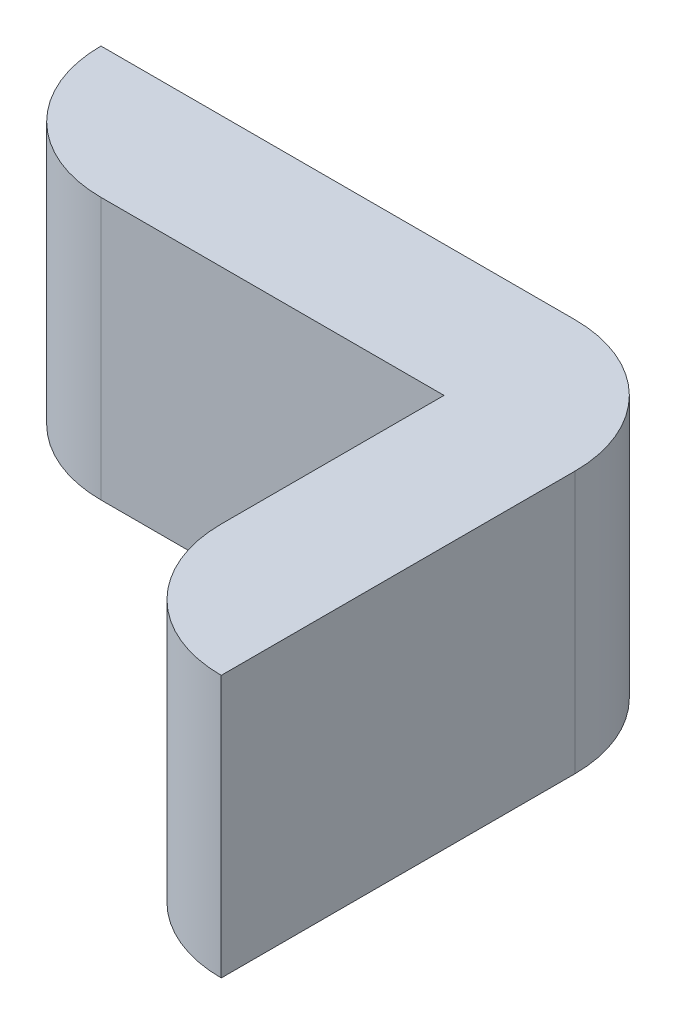
ISO-10303-21;
HEADER;
FILE_DESCRIPTION(('STEP AP214'),'2;1');
FILE_NAME('part.step','',(''),(''),'','','');
FILE_SCHEMA(('AUTOMOTIVE_DESIGN { 1 0 10303 214 1 1 1 1 }'));
ENDSEC;
DATA;
#1=APPLICATION_CONTEXT('core data for automotive mechanical design processes');
#2=APPLICATION_PROTOCOL_DEFINITION('international standard','automotive_design',2000,#1);
#3=PRODUCT_CONTEXT('',#1,'mechanical');
#4=PRODUCT('Part','Part','',(#3));
#5=PRODUCT_RELATED_PRODUCT_CATEGORY('part','',(#4));
#6=PRODUCT_DEFINITION_FORMATION('','',#4);
#7=PRODUCT_DEFINITION_CONTEXT('part definition',#1,'design');
#8=PRODUCT_DEFINITION('design','',#6,#7);
#9=PRODUCT_DEFINITION_SHAPE('','',#8);
#10=(LENGTH_UNIT() NAMED_UNIT(*) SI_UNIT(.MILLI.,.METRE.));
#11=(NAMED_UNIT(*) PLANE_ANGLE_UNIT() SI_UNIT($,.RADIAN.));
#12=(NAMED_UNIT(*) SI_UNIT($,.STERADIAN.) SOLID_ANGLE_UNIT());
#13=UNCERTAINTY_MEASURE_WITH_UNIT(LENGTH_MEASURE(1.E-05),#10,'distance_accuracy_value','');
#14=(GEOMETRIC_REPRESENTATION_CONTEXT(3) GLOBAL_UNCERTAINTY_ASSIGNED_CONTEXT((#13)) GLOBAL_UNIT_ASSIGNED_CONTEXT((#10,
#11,#12)) REPRESENTATION_CONTEXT('',''));
#15=CARTESIAN_POINT('',(0.,0.,0.));
#16=DIRECTION('',(0.,0.,1.));
#17=DIRECTION('',(1.,0.,0.));
#18=AXIS2_PLACEMENT_3D('',#15,#16,#17);
#19=CARTESIAN_POINT('',(1.462781115147,1.0414,0.4699));
#20=DIRECTION('',(-1.,0.,0.));
#21=DIRECTION('',(0.,0.,1.));
#22=AXIS2_PLACEMENT_3D('',#19,#20,#21);
#23=PLANE('',#22);
#24=DIRECTION('',(0.,0.,-1.));
#25=VECTOR('',#24,1.);
#26=CARTESIAN_POINT('',(1.462781115147,1.0414,0.));
#27=LINE('',#26,#25);
#28=CARTESIAN_POINT('',(1.462781115147,1.0414,0.127));
#29=VERTEX_POINT('',#28);
#30=CARTESIAN_POINT('',(1.462781115147,1.0414,0.4699));
#31=VERTEX_POINT('',#30);
#32=EDGE_CURVE('E129',#29,#31,#27,.F.);
#33=ORIENTED_EDGE('',*,*,#32,.F.);
#34=DIRECTION('',(0.,-1.,0.));
#35=VECTOR('',#34,1.);
#36=CARTESIAN_POINT('',(1.462781115147,1.0414,0.127));
#37=LINE('',#36,#35);
#38=CARTESIAN_POINT('',(1.462781115147,1.2954,0.127));
#39=VERTEX_POINT('',#38);
#40=EDGE_CURVE('E82',#39,#29,#37,.T.);
#41=ORIENTED_EDGE('',*,*,#40,.F.);
#42=DIRECTION('',(0.,0.,-1.));
#43=VECTOR('',#42,1.);
#44=CARTESIAN_POINT('',(1.462781115147,1.2954,0.));
#45=LINE('',#44,#43);
#46=CARTESIAN_POINT('',(1.462781115147,1.2954,0.4699));
#47=VERTEX_POINT('',#46);
#48=EDGE_CURVE('E77',#39,#47,#45,.F.);
#49=ORIENTED_EDGE('',*,*,#48,.T.);
#50=DIRECTION('',(0.,-1.,0.));
#51=VECTOR('',#50,1.);
#52=CARTESIAN_POINT('',(1.462781115147,1.0414,0.4699));
#53=LINE('',#52,#51);
#54=EDGE_CURVE('E123',#31,#47,#53,.F.);
#55=ORIENTED_EDGE('',*,*,#54,.F.);
#56=EDGE_LOOP('',(#33,#41,#49,#55));
#57=FACE_BOUND('',#56,.T.);
#58=ADVANCED_FACE('F17',(#57),#23,.F.);
#59=CARTESIAN_POINT('',(1.462781115147,1.0414,0.3429));
#60=DIRECTION('',(0.,-1.,0.));
#61=DIRECTION('',(0.,0.,-1.));
#62=AXIS2_PLACEMENT_3D('',#59,#60,#61);
#63=CYLINDRICAL_SURFACE('',#62,0.127);
#64=CARTESIAN_POINT('',(1.462781115147,1.2954,0.3429));
#65=DIRECTION('',(0.,-1.,0.));
#66=DIRECTION('',(0.,0.,-1.));
#67=AXIS2_PLACEMENT_3D('',#64,#65,#66);
#68=CIRCLE('',#67,0.127);
#69=CARTESIAN_POINT('',(1.335781115147,1.2954,0.3429));
#70=VERTEX_POINT('',#69);
#71=EDGE_CURVE('E107',#47,#70,#68,.T.);
#72=ORIENTED_EDGE('',*,*,#71,.T.);
#73=DIRECTION('',(0.,1.,0.));
#74=VECTOR('',#73,1.);
#75=CARTESIAN_POINT('',(1.335781115147,1.0414,0.3429));
#76=LINE('',#75,#74);
#77=CARTESIAN_POINT('',(1.335781115147,1.0414,0.3429));
#78=VERTEX_POINT('',#77);
#79=EDGE_CURVE('E118',#70,#78,#76,.F.);
#80=ORIENTED_EDGE('',*,*,#79,.T.);
#81=CARTESIAN_POINT('',(1.462781115147,1.0414,0.3429));
#82=DIRECTION('',(0.,-1.,0.));
#83=DIRECTION('',(0.,0.,-1.));
#84=AXIS2_PLACEMENT_3D('',#81,#82,#83);
#85=CIRCLE('',#84,0.127);
#86=EDGE_CURVE('E126',#31,#78,#85,.T.);
#87=ORIENTED_EDGE('',*,*,#86,.F.);
#88=ORIENTED_EDGE('',*,*,#54,.T.);
#89=EDGE_LOOP('',(#72,#80,#87,#88));
#90=FACE_BOUND('',#89,.T.);
#91=ADVANCED_FACE('F133',(#90),#63,.T.);
#92=CARTESIAN_POINT('',(1.335781115147,1.0414,0.127));
#93=DIRECTION('',(1.,0.,0.));
#94=DIRECTION('',(0.,0.,-1.));
#95=AXIS2_PLACEMENT_3D('',#92,#93,#94);
#96=PLANE('',#95);
#97=ORIENTED_EDGE('',*,*,#79,.F.);
#98=DIRECTION('',(0.,0.,-1.));
#99=VECTOR('',#98,1.);
#100=CARTESIAN_POINT('',(1.335781115147,1.2954,0.));
#101=LINE('',#100,#99);
#102=CARTESIAN_POINT('',(1.335781115147,1.2954,0.127));
#103=VERTEX_POINT('',#102);
#104=EDGE_CURVE('E102',#70,#103,#101,.T.);
#105=ORIENTED_EDGE('',*,*,#104,.T.);
#106=DIRECTION('',(0.,1.,0.));
#107=VECTOR('',#106,1.);
#108=CARTESIAN_POINT('',(1.335781115147,1.0414,0.127));
#109=LINE('',#108,#107);
#110=CARTESIAN_POINT('',(1.335781115147,1.0414,0.127));
#111=VERTEX_POINT('',#110);
#112=EDGE_CURVE('E115',#103,#111,#109,.F.);
#113=ORIENTED_EDGE('',*,*,#112,.T.);
#114=DIRECTION('',(0.,0.,-1.));
#115=VECTOR('',#114,1.);
#116=CARTESIAN_POINT('',(1.335781115147,1.0414,0.));
#117=LINE('',#116,#115);
#118=EDGE_CURVE('E128',#78,#111,#117,.T.);
#119=ORIENTED_EDGE('',*,*,#118,.F.);
#120=EDGE_LOOP('',(#97,#105,#113,#119));
#121=FACE_BOUND('',#120,.T.);
#122=ADVANCED_FACE('F158',(#121),#96,.F.);
#123=CARTESIAN_POINT('',(1.0033,1.0414,0.127));
#124=DIRECTION('',(0.,0.,-1.));
#125=DIRECTION('',(-1.,0.,0.));
#126=AXIS2_PLACEMENT_3D('',#123,#124,#125);
#127=PLANE('',#126);
#128=ORIENTED_EDGE('',*,*,#112,.F.);
#129=DIRECTION('',(1.,0.,0.));
#130=VECTOR('',#129,1.);
#131=CARTESIAN_POINT('',(0.8763,1.2954,0.127));
#132=LINE('',#131,#130);
#133=CARTESIAN_POINT('',(1.0033,1.2954,0.127));
#134=VERTEX_POINT('',#133);
#135=EDGE_CURVE('E98',#103,#134,#132,.F.);
#136=ORIENTED_EDGE('',*,*,#135,.T.);
#137=DIRECTION('',(0.,-1.,0.));
#138=VECTOR('',#137,1.);
#139=CARTESIAN_POINT('',(1.0033,1.0414,0.127));
#140=LINE('',#139,#138);
#141=CARTESIAN_POINT('',(1.0033,1.0414,0.127));
#142=VERTEX_POINT('',#141);
#143=EDGE_CURVE('E101',#142,#134,#140,.F.);
#144=ORIENTED_EDGE('',*,*,#143,.F.);
#145=DIRECTION('',(1.,0.,0.));
#146=VECTOR('',#145,1.);
#147=CARTESIAN_POINT('',(0.8763,1.0414,0.127));
#148=LINE('',#147,#146);
#149=EDGE_CURVE('E94',#111,#142,#148,.F.);
#150=ORIENTED_EDGE('',*,*,#149,.F.);
#151=EDGE_LOOP('',(#128,#136,#144,#150));
#152=FACE_BOUND('',#151,.T.);
#153=ADVANCED_FACE('F156',(#152),#127,.F.);
#154=CARTESIAN_POINT('',(1.335781115147,1.0414,0.127));
#155=DIRECTION('',(0.,-1.,0.));
#156=DIRECTION('',(0.,0.,-1.));
#157=AXIS2_PLACEMENT_3D('',#154,#155,#156);
#158=CYLINDRICAL_SURFACE('',#157,0.127);
#159=CARTESIAN_POINT('',(1.335781115147,1.2954,0.127));
#160=DIRECTION('',(0.,-1.,0.));
#161=DIRECTION('',(0.,0.,-1.));
#162=AXIS2_PLACEMENT_3D('',#159,#160,#161);
#163=CIRCLE('',#162,0.127);
#164=CARTESIAN_POINT('',(1.335781115147,1.2954,0.));
#165=VERTEX_POINT('',#164);
#166=EDGE_CURVE('E20',#165,#39,#163,.T.);
#167=ORIENTED_EDGE('',*,*,#166,.T.);
#168=ORIENTED_EDGE('',*,*,#40,.T.);
#169=CARTESIAN_POINT('',(1.335781115147,1.0414,0.127));
#170=DIRECTION('',(0.,-1.,0.));
#171=DIRECTION('',(0.,0.,-1.));
#172=AXIS2_PLACEMENT_3D('',#169,#170,#171);
#173=CIRCLE('',#172,0.127);
#174=CARTESIAN_POINT('',(1.335781115147,1.0414,0.));
#175=VERTEX_POINT('',#174);
#176=EDGE_CURVE('E92',#175,#29,#173,.T.);
#177=ORIENTED_EDGE('',*,*,#176,.F.);
#178=DIRECTION('',(0.,1.,0.));
#179=VECTOR('',#178,1.);
#180=CARTESIAN_POINT('',(1.335781115147,1.0414,0.));
#181=LINE('',#180,#179);
#182=EDGE_CURVE('E86',#175,#165,#181,.T.);
#183=ORIENTED_EDGE('',*,*,#182,.T.);
#184=EDGE_LOOP('',(#167,#168,#177,#183));
#185=FACE_BOUND('',#184,.T.);
#186=ADVANCED_FACE('F90',(#185),#158,.T.);
#187=CARTESIAN_POINT('',(0.8763,1.2954,0.));
#188=DIRECTION('',(0.,-1.,0.));
#189=DIRECTION('',(0.,0.,-1.));
#190=AXIS2_PLACEMENT_3D('',#187,#188,#189);
#191=PLANE('',#190);
#192=ORIENTED_EDGE('',*,*,#135,.F.);
#193=ORIENTED_EDGE('',*,*,#104,.F.);
#194=ORIENTED_EDGE('',*,*,#71,.F.);
#195=ORIENTED_EDGE('',*,*,#48,.F.);
#196=ORIENTED_EDGE('',*,*,#166,.F.);
#197=DIRECTION('',(1.,0.,0.));
#198=VECTOR('',#197,1.);
#199=CARTESIAN_POINT('',(1.335781115147,1.2954,0.));
#200=LINE('',#199,#198);
#201=CARTESIAN_POINT('',(0.8763,1.2954,0.));
#202=VERTEX_POINT('',#201);
#203=EDGE_CURVE('E74',#165,#202,#200,.F.);
#204=ORIENTED_EDGE('',*,*,#203,.T.);
#205=CARTESIAN_POINT('',(1.0033,1.2954,0.));
#206=DIRECTION('',(0.,-1.,0.));
#207=DIRECTION('',(0.,0.,-1.));
#208=AXIS2_PLACEMENT_3D('',#205,#206,#207);
#209=CIRCLE('',#208,0.127);
#210=EDGE_CURVE('E114',#134,#202,#209,.T.);
#211=ORIENTED_EDGE('',*,*,#210,.F.);
#212=EDGE_LOOP('',(#192,#193,#194,#195,#196,#204,#211));
#213=FACE_BOUND('',#212,.T.);
#214=ADVANCED_FACE('F72',(#213),#191,.F.);
#215=CARTESIAN_POINT('',(1.0033,1.0414,0.));
#216=DIRECTION('',(0.,-1.,0.));
#217=DIRECTION('',(0.,0.,-1.));
#218=AXIS2_PLACEMENT_3D('',#215,#216,#217);
#219=CYLINDRICAL_SURFACE('',#218,0.127);
#220=ORIENTED_EDGE('',*,*,#210,.T.);
#221=DIRECTION('',(0.,1.,0.));
#222=VECTOR('',#221,1.);
#223=CARTESIAN_POINT('',(0.8763,1.0414,0.));
#224=LINE('',#223,#222);
#225=CARTESIAN_POINT('',(0.8763,1.0414,0.));
#226=VERTEX_POINT('',#225);
#227=EDGE_CURVE('E26',#202,#226,#224,.F.);
#228=ORIENTED_EDGE('',*,*,#227,.T.);
#229=CARTESIAN_POINT('',(1.0033,1.0414,0.));
#230=DIRECTION('',(0.,-1.,0.));
#231=DIRECTION('',(0.,0.,-1.));
#232=AXIS2_PLACEMENT_3D('',#229,#230,#231);
#233=CIRCLE('',#232,0.127);
#234=EDGE_CURVE('E34',#142,#226,#233,.T.);
#235=ORIENTED_EDGE('',*,*,#234,.F.);
#236=ORIENTED_EDGE('',*,*,#143,.T.);
#237=EDGE_LOOP('',(#220,#228,#235,#236));
#238=FACE_BOUND('',#237,.T.);
#239=ADVANCED_FACE('F141',(#238),#219,.T.);
#240=CARTESIAN_POINT('',(0.8763,1.0414,0.));
#241=DIRECTION('',(0.,-1.,0.));
#242=DIRECTION('',(0.,0.,-1.));
#243=AXIS2_PLACEMENT_3D('',#240,#241,#242);
#244=PLANE('',#243);
#245=ORIENTED_EDGE('',*,*,#149,.T.);
#246=ORIENTED_EDGE('',*,*,#234,.T.);
#247=DIRECTION('',(1.,0.,0.));
#248=VECTOR('',#247,1.);
#249=CARTESIAN_POINT('',(1.335781115147,1.0414,0.));
#250=LINE('',#249,#248);
#251=EDGE_CURVE('E11',#226,#175,#250,.T.);
#252=ORIENTED_EDGE('',*,*,#251,.T.);
#253=ORIENTED_EDGE('',*,*,#176,.T.);
#254=ORIENTED_EDGE('',*,*,#32,.T.);
#255=ORIENTED_EDGE('',*,*,#86,.T.);
#256=ORIENTED_EDGE('',*,*,#118,.T.);
#257=EDGE_LOOP('',(#245,#246,#252,#253,#254,#255,#256));
#258=FACE_BOUND('',#257,.T.);
#259=ADVANCED_FACE('F139',(#258),#244,.T.);
#260=CARTESIAN_POINT('',(1.335781115147,1.0414,0.));
#261=DIRECTION('',(0.,0.,1.));
#262=DIRECTION('',(1.,0.,0.));
#263=AXIS2_PLACEMENT_3D('',#260,#261,#262);
#264=PLANE('',#263);
#265=ORIENTED_EDGE('',*,*,#227,.F.);
#266=ORIENTED_EDGE('',*,*,#203,.F.);
#267=ORIENTED_EDGE('',*,*,#182,.F.);
#268=ORIENTED_EDGE('',*,*,#251,.F.);
#269=EDGE_LOOP('',(#265,#266,#267,#268));
#270=FACE_BOUND('',#269,.T.);
#271=ADVANCED_FACE('F85',(#270),#264,.F.);
#272=CLOSED_SHELL('',(#58,#91,#122,#153,#186,#214,#239,#259,#271));
#273=MANIFOLD_SOLID_BREP('B1',#272);
#274=ADVANCED_BREP_SHAPE_REPRESENTATION('',(#18,#273),#14);
#275=SHAPE_DEFINITION_REPRESENTATION(#9,#274);
ENDSEC;
END-ISO-10303-21;
